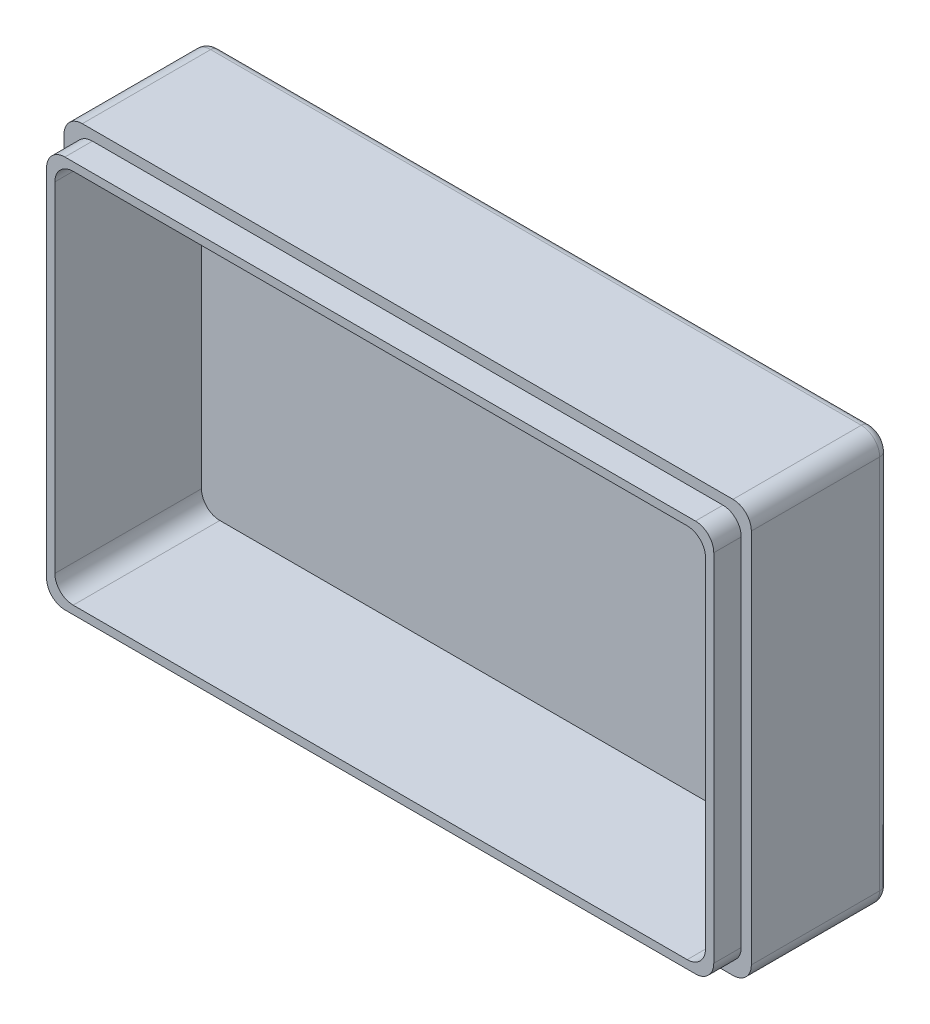
ISO-10303-21;
HEADER;
FILE_DESCRIPTION(('STEP AP214'),'2;1');
FILE_NAME('part.step','',(''),(''),'','','');
FILE_SCHEMA(('AUTOMOTIVE_DESIGN { 1 0 10303 214 1 1 1 1 }'));
ENDSEC;
DATA;
#1=APPLICATION_CONTEXT('core data for automotive mechanical design processes');
#2=APPLICATION_PROTOCOL_DEFINITION('international standard','automotive_design',2000,#1);
#3=PRODUCT_CONTEXT('',#1,'mechanical');
#4=PRODUCT('Part','Part','',(#3));
#5=PRODUCT_RELATED_PRODUCT_CATEGORY('part','',(#4));
#6=PRODUCT_DEFINITION_FORMATION('','',#4);
#7=PRODUCT_DEFINITION_CONTEXT('part definition',#1,'design');
#8=PRODUCT_DEFINITION('design','',#6,#7);
#9=PRODUCT_DEFINITION_SHAPE('','',#8);
#10=(LENGTH_UNIT() NAMED_UNIT(*) SI_UNIT(.MILLI.,.METRE.));
#11=(NAMED_UNIT(*) PLANE_ANGLE_UNIT() SI_UNIT($,.RADIAN.));
#12=(NAMED_UNIT(*) SI_UNIT($,.STERADIAN.) SOLID_ANGLE_UNIT());
#13=UNCERTAINTY_MEASURE_WITH_UNIT(LENGTH_MEASURE(1.E-05),#10,'distance_accuracy_value','');
#14=(GEOMETRIC_REPRESENTATION_CONTEXT(3) GLOBAL_UNCERTAINTY_ASSIGNED_CONTEXT((#13)) GLOBAL_UNIT_ASSIGNED_CONTEXT((#10,
#11,#12)) REPRESENTATION_CONTEXT('',''));
#15=CARTESIAN_POINT('',(0.,0.,0.));
#16=DIRECTION('',(0.,0.,1.));
#17=DIRECTION('',(1.,0.,0.));
#18=AXIS2_PLACEMENT_3D('',#15,#16,#17);
#19=CARTESIAN_POINT('',(0.,0.,18.));
#20=DIRECTION('',(0.,0.,1.));
#21=DIRECTION('',(1.,0.,0.));
#22=AXIS2_PLACEMENT_3D('',#19,#20,#21);
#23=PLANE('',#22);
#24=DIRECTION('',(-1.,0.,0.));
#25=VECTOR('',#24,1.);
#26=CARTESIAN_POINT('',(35.5,20.5,18.));
#27=LINE('',#26,#25);
#28=CARTESIAN_POINT('',(33.5,20.5,18.));
#29=VERTEX_POINT('',#28);
#30=CARTESIAN_POINT('',(-33.5,20.5,18.));
#31=VERTEX_POINT('',#30);
#32=EDGE_CURVE('E243',#29,#31,#27,.T.);
#33=ORIENTED_EDGE('',*,*,#32,.F.);
#34=CARTESIAN_POINT('',(33.5,18.5,18.));
#35=DIRECTION('',(0.,0.,1.));
#36=DIRECTION('',(1.,0.,0.));
#37=AXIS2_PLACEMENT_3D('',#34,#35,#36);
#38=CIRCLE('',#37,2.);
#39=CARTESIAN_POINT('',(35.5,18.5,18.));
#40=VERTEX_POINT('',#39);
#41=EDGE_CURVE('E226',#29,#40,#38,.F.);
#42=ORIENTED_EDGE('',*,*,#41,.T.);
#43=DIRECTION('',(0.,1.,0.));
#44=VECTOR('',#43,1.);
#45=CARTESIAN_POINT('',(35.5,-20.5,18.));
#46=LINE('',#45,#44);
#47=CARTESIAN_POINT('',(35.5,-18.5,18.));
#48=VERTEX_POINT('',#47);
#49=EDGE_CURVE('E267',#48,#40,#46,.T.);
#50=ORIENTED_EDGE('',*,*,#49,.F.);
#51=CARTESIAN_POINT('',(33.5,-18.5,18.));
#52=DIRECTION('',(0.,0.,1.));
#53=DIRECTION('',(1.,0.,0.));
#54=AXIS2_PLACEMENT_3D('',#51,#52,#53);
#55=CIRCLE('',#54,2.);
#56=CARTESIAN_POINT('',(33.5,-20.5,18.));
#57=VERTEX_POINT('',#56);
#58=EDGE_CURVE('E347',#48,#57,#55,.F.);
#59=ORIENTED_EDGE('',*,*,#58,.T.);
#60=DIRECTION('',(1.,0.,0.));
#61=VECTOR('',#60,1.);
#62=CARTESIAN_POINT('',(-35.5,-20.5,18.));
#63=LINE('',#62,#61);
#64=CARTESIAN_POINT('',(-33.5,-20.5,18.));
#65=VERTEX_POINT('',#64);
#66=EDGE_CURVE('E256',#65,#57,#63,.T.);
#67=ORIENTED_EDGE('',*,*,#66,.F.);
#68=CARTESIAN_POINT('',(-33.5,-18.5,18.));
#69=DIRECTION('',(0.,0.,1.));
#70=DIRECTION('',(1.,0.,0.));
#71=AXIS2_PLACEMENT_3D('',#68,#69,#70);
#72=CIRCLE('',#71,2.);
#73=CARTESIAN_POINT('',(-35.5,-18.5,18.));
#74=VERTEX_POINT('',#73);
#75=EDGE_CURVE('E345',#65,#74,#72,.F.);
#76=ORIENTED_EDGE('',*,*,#75,.T.);
#77=DIRECTION('',(0.,-1.,0.));
#78=VECTOR('',#77,1.);
#79=CARTESIAN_POINT('',(-35.5,20.5,18.));
#80=LINE('',#79,#78);
#81=CARTESIAN_POINT('',(-35.5,18.5,18.));
#82=VERTEX_POINT('',#81);
#83=EDGE_CURVE('E252',#82,#74,#80,.T.);
#84=ORIENTED_EDGE('',*,*,#83,.F.);
#85=CARTESIAN_POINT('',(-33.5,18.5,18.));
#86=DIRECTION('',(0.,0.,1.));
#87=DIRECTION('',(1.,0.,0.));
#88=AXIS2_PLACEMENT_3D('',#85,#86,#87);
#89=CIRCLE('',#88,2.);
#90=EDGE_CURVE('E236',#82,#31,#89,.F.);
#91=ORIENTED_EDGE('',*,*,#90,.T.);
#92=EDGE_LOOP('',(#33,#42,#50,#59,#67,#76,#84,#91));
#93=FACE_BOUND('',#92,.T.);
#94=DIRECTION('',(0.,1.,0.));
#95=VECTOR('',#94,1.);
#96=CARTESIAN_POINT('',(36.4,-21.4,18.));
#97=LINE('',#96,#95);
#98=CARTESIAN_POINT('',(36.4,-19.4,18.));
#99=VERTEX_POINT('',#98);
#100=CARTESIAN_POINT('',(36.4,19.4,18.));
#101=VERTEX_POINT('',#100);
#102=EDGE_CURVE('E418',#99,#101,#97,.T.);
#103=ORIENTED_EDGE('',*,*,#102,.T.);
#104=CARTESIAN_POINT('',(34.4,19.4,18.));
#105=DIRECTION('',(0.,0.,1.));
#106=DIRECTION('',(1.,0.,0.));
#107=AXIS2_PLACEMENT_3D('',#104,#105,#106);
#108=CIRCLE('',#107,2.);
#109=CARTESIAN_POINT('',(34.4,21.4,18.));
#110=VERTEX_POINT('',#109);
#111=EDGE_CURVE('E302',#101,#110,#108,.T.);
#112=ORIENTED_EDGE('',*,*,#111,.T.);
#113=DIRECTION('',(-1.,0.,0.));
#114=VECTOR('',#113,1.);
#115=CARTESIAN_POINT('',(36.4,21.4,18.));
#116=LINE('',#115,#114);
#117=CARTESIAN_POINT('',(-34.4,21.4,18.));
#118=VERTEX_POINT('',#117);
#119=EDGE_CURVE('E426',#110,#118,#116,.T.);
#120=ORIENTED_EDGE('',*,*,#119,.T.);
#121=CARTESIAN_POINT('',(-34.4,19.4,18.));
#122=DIRECTION('',(0.,0.,1.));
#123=DIRECTION('',(1.,0.,0.));
#124=AXIS2_PLACEMENT_3D('',#121,#122,#123);
#125=CIRCLE('',#124,2.);
#126=CARTESIAN_POINT('',(-36.4,19.4,18.));
#127=VERTEX_POINT('',#126);
#128=EDGE_CURVE('E296',#118,#127,#125,.T.);
#129=ORIENTED_EDGE('',*,*,#128,.T.);
#130=DIRECTION('',(0.,-1.,0.));
#131=VECTOR('',#130,1.);
#132=CARTESIAN_POINT('',(-36.4,21.4,18.));
#133=LINE('',#132,#131);
#134=CARTESIAN_POINT('',(-36.4,-19.4,18.));
#135=VERTEX_POINT('',#134);
#136=EDGE_CURVE('E408',#127,#135,#133,.T.);
#137=ORIENTED_EDGE('',*,*,#136,.T.);
#138=CARTESIAN_POINT('',(-34.4,-19.4,18.));
#139=DIRECTION('',(0.,0.,1.));
#140=DIRECTION('',(1.,0.,0.));
#141=AXIS2_PLACEMENT_3D('',#138,#139,#140);
#142=CIRCLE('',#141,2.);
#143=CARTESIAN_POINT('',(-34.4,-21.4,18.));
#144=VERTEX_POINT('',#143);
#145=EDGE_CURVE('E298',#135,#144,#142,.T.);
#146=ORIENTED_EDGE('',*,*,#145,.T.);
#147=DIRECTION('',(1.,0.,0.));
#148=VECTOR('',#147,1.);
#149=CARTESIAN_POINT('',(-36.4,-21.4,18.));
#150=LINE('',#149,#148);
#151=CARTESIAN_POINT('',(34.4,-21.4,18.));
#152=VERTEX_POINT('',#151);
#153=EDGE_CURVE('E414',#144,#152,#150,.T.);
#154=ORIENTED_EDGE('',*,*,#153,.T.);
#155=CARTESIAN_POINT('',(34.4,-19.4,18.));
#156=DIRECTION('',(0.,0.,1.));
#157=DIRECTION('',(1.,0.,0.));
#158=AXIS2_PLACEMENT_3D('',#155,#156,#157);
#159=CIRCLE('',#158,2.);
#160=EDGE_CURVE('E300',#152,#99,#159,.T.);
#161=ORIENTED_EDGE('',*,*,#160,.T.);
#162=EDGE_LOOP('',(#103,#112,#120,#129,#137,#146,#154,#161));
#163=FACE_BOUND('',#162,.T.);
#164=ADVANCED_FACE('F39',(#93,#163),#23,.T.);
#165=CARTESIAN_POINT('',(35.5,20.5,2.));
#166=DIRECTION('',(0.,1.,0.));
#167=DIRECTION('',(0.,0.,1.));
#168=AXIS2_PLACEMENT_3D('',#165,#166,#167);
#169=PLANE('',#168);
#170=DIRECTION('',(-1.,0.,0.));
#171=VECTOR('',#170,1.);
#172=CARTESIAN_POINT('',(35.5,20.5,2.));
#173=LINE('',#172,#171);
#174=CARTESIAN_POINT('',(33.5,20.5,2.));
#175=VERTEX_POINT('',#174);
#176=CARTESIAN_POINT('',(-33.5,20.5,2.));
#177=VERTEX_POINT('',#176);
#178=EDGE_CURVE('E246',#175,#177,#173,.T.);
#179=ORIENTED_EDGE('',*,*,#178,.F.);
#180=DIRECTION('',(0.,0.,1.));
#181=VECTOR('',#180,1.);
#182=CARTESIAN_POINT('',(33.5,20.5,18.));
#183=LINE('',#182,#181);
#184=EDGE_CURVE('E230',#175,#29,#183,.T.);
#185=ORIENTED_EDGE('',*,*,#184,.T.);
#186=ORIENTED_EDGE('',*,*,#32,.T.);
#187=DIRECTION('',(0.,0.,1.));
#188=VECTOR('',#187,1.);
#189=CARTESIAN_POINT('',(-33.5,20.5,2.));
#190=LINE('',#189,#188);
#191=EDGE_CURVE('E248',#31,#177,#190,.F.);
#192=ORIENTED_EDGE('',*,*,#191,.T.);
#193=EDGE_LOOP('',(#179,#185,#186,#192));
#194=FACE_BOUND('',#193,.T.);
#195=ADVANCED_FACE('F242',(#194),#169,.F.);
#196=CARTESIAN_POINT('',(35.5,-20.5,2.));
#197=DIRECTION('',(1.,0.,0.));
#198=DIRECTION('',(0.,0.,-1.));
#199=AXIS2_PLACEMENT_3D('',#196,#197,#198);
#200=PLANE('',#199);
#201=ORIENTED_EDGE('',*,*,#49,.T.);
#202=DIRECTION('',(0.,0.,1.));
#203=VECTOR('',#202,1.);
#204=CARTESIAN_POINT('',(35.5,18.5,2.));
#205=LINE('',#204,#203);
#206=CARTESIAN_POINT('',(35.5,18.5,2.));
#207=VERTEX_POINT('',#206);
#208=EDGE_CURVE('E231',#40,#207,#205,.F.);
#209=ORIENTED_EDGE('',*,*,#208,.T.);
#210=DIRECTION('',(0.,1.,0.));
#211=VECTOR('',#210,1.);
#212=CARTESIAN_POINT('',(35.5,-20.5,2.));
#213=LINE('',#212,#211);
#214=CARTESIAN_POINT('',(35.5,-18.5,2.));
#215=VERTEX_POINT('',#214);
#216=EDGE_CURVE('E262',#215,#207,#213,.T.);
#217=ORIENTED_EDGE('',*,*,#216,.F.);
#218=DIRECTION('',(0.,0.,1.));
#219=VECTOR('',#218,1.);
#220=CARTESIAN_POINT('',(35.5,-18.5,18.));
#221=LINE('',#220,#219);
#222=EDGE_CURVE('E247',#215,#48,#221,.T.);
#223=ORIENTED_EDGE('',*,*,#222,.T.);
#224=EDGE_LOOP('',(#201,#209,#217,#223));
#225=FACE_BOUND('',#224,.T.);
#226=ADVANCED_FACE('F451',(#225),#200,.F.);
#227=CARTESIAN_POINT('',(-35.5,-20.5,2.));
#228=DIRECTION('',(0.,-1.,0.));
#229=DIRECTION('',(0.,0.,-1.));
#230=AXIS2_PLACEMENT_3D('',#227,#228,#229);
#231=PLANE('',#230);
#232=DIRECTION('',(1.,0.,0.));
#233=VECTOR('',#232,1.);
#234=CARTESIAN_POINT('',(-35.5,-20.5,2.));
#235=LINE('',#234,#233);
#236=CARTESIAN_POINT('',(-33.5,-20.5,2.));
#237=VERTEX_POINT('',#236);
#238=CARTESIAN_POINT('',(33.5,-20.5,2.));
#239=VERTEX_POINT('',#238);
#240=EDGE_CURVE('E441',#237,#239,#235,.T.);
#241=ORIENTED_EDGE('',*,*,#240,.F.);
#242=DIRECTION('',(0.,0.,1.));
#243=VECTOR('',#242,1.);
#244=CARTESIAN_POINT('',(-33.5,-20.5,18.));
#245=LINE('',#244,#243);
#246=EDGE_CURVE('E288',#237,#65,#245,.T.);
#247=ORIENTED_EDGE('',*,*,#246,.T.);
#248=ORIENTED_EDGE('',*,*,#66,.T.);
#249=DIRECTION('',(0.,0.,1.));
#250=VECTOR('',#249,1.);
#251=CARTESIAN_POINT('',(33.5,-20.5,2.));
#252=LINE('',#251,#250);
#253=EDGE_CURVE('E286',#57,#239,#252,.F.);
#254=ORIENTED_EDGE('',*,*,#253,.T.);
#255=EDGE_LOOP('',(#241,#247,#248,#254));
#256=FACE_BOUND('',#255,.T.);
#257=ADVANCED_FACE('F457',(#256),#231,.F.);
#258=CARTESIAN_POINT('',(-35.5,20.5,2.));
#259=DIRECTION('',(-1.,0.,0.));
#260=DIRECTION('',(0.,0.,1.));
#261=AXIS2_PLACEMENT_3D('',#258,#259,#260);
#262=PLANE('',#261);
#263=DIRECTION('',(0.,-1.,0.));
#264=VECTOR('',#263,1.);
#265=CARTESIAN_POINT('',(-35.5,20.5,2.));
#266=LINE('',#265,#264);
#267=CARTESIAN_POINT('',(-35.5,18.5,2.));
#268=VERTEX_POINT('',#267);
#269=CARTESIAN_POINT('',(-35.5,-18.5,2.));
#270=VERTEX_POINT('',#269);
#271=EDGE_CURVE('E439',#268,#270,#266,.T.);
#272=ORIENTED_EDGE('',*,*,#271,.F.);
#273=DIRECTION('',(0.,0.,1.));
#274=VECTOR('',#273,1.);
#275=CARTESIAN_POINT('',(-35.5,18.5,18.));
#276=LINE('',#275,#274);
#277=EDGE_CURVE('E283',#268,#82,#276,.T.);
#278=ORIENTED_EDGE('',*,*,#277,.T.);
#279=ORIENTED_EDGE('',*,*,#83,.T.);
#280=DIRECTION('',(0.,0.,1.));
#281=VECTOR('',#280,1.);
#282=CARTESIAN_POINT('',(-35.5,-18.5,2.));
#283=LINE('',#282,#281);
#284=EDGE_CURVE('E281',#74,#270,#283,.F.);
#285=ORIENTED_EDGE('',*,*,#284,.T.);
#286=EDGE_LOOP('',(#272,#278,#279,#285));
#287=FACE_BOUND('',#286,.T.);
#288=ADVANCED_FACE('F465',(#287),#262,.F.);
#289=CARTESIAN_POINT('',(0.,0.,2.));
#290=DIRECTION('',(0.,0.,1.));
#291=DIRECTION('',(1.,0.,0.));
#292=AXIS2_PLACEMENT_3D('',#289,#290,#291);
#293=PLANE('',#292);
#294=ORIENTED_EDGE('',*,*,#216,.T.);
#295=CARTESIAN_POINT('',(33.5,18.5,2.));
#296=DIRECTION('',(0.,0.,1.));
#297=DIRECTION('',(1.,0.,0.));
#298=AXIS2_PLACEMENT_3D('',#295,#296,#297);
#299=CIRCLE('',#298,2.);
#300=EDGE_CURVE('E279',#207,#175,#299,.T.);
#301=ORIENTED_EDGE('',*,*,#300,.T.);
#302=ORIENTED_EDGE('',*,*,#178,.T.);
#303=CARTESIAN_POINT('',(-33.5,18.5,2.));
#304=DIRECTION('',(0.,0.,1.));
#305=DIRECTION('',(1.,0.,0.));
#306=AXIS2_PLACEMENT_3D('',#303,#304,#305);
#307=CIRCLE('',#306,2.);
#308=EDGE_CURVE('E277',#177,#268,#307,.T.);
#309=ORIENTED_EDGE('',*,*,#308,.T.);
#310=ORIENTED_EDGE('',*,*,#271,.T.);
#311=CARTESIAN_POINT('',(-33.5,-18.5,2.));
#312=DIRECTION('',(0.,0.,1.));
#313=DIRECTION('',(1.,0.,0.));
#314=AXIS2_PLACEMENT_3D('',#311,#312,#313);
#315=CIRCLE('',#314,2.);
#316=EDGE_CURVE('E275',#270,#237,#315,.T.);
#317=ORIENTED_EDGE('',*,*,#316,.T.);
#318=ORIENTED_EDGE('',*,*,#240,.T.);
#319=CARTESIAN_POINT('',(33.5,-18.5,2.));
#320=DIRECTION('',(0.,0.,1.));
#321=DIRECTION('',(1.,0.,0.));
#322=AXIS2_PLACEMENT_3D('',#319,#320,#321);
#323=CIRCLE('',#322,2.);
#324=EDGE_CURVE('E273',#239,#215,#323,.T.);
#325=ORIENTED_EDGE('',*,*,#324,.T.);
#326=EDGE_LOOP('',(#294,#301,#302,#309,#310,#317,#318,#325));
#327=FACE_BOUND('',#326,.T.);
#328=ADVANCED_FACE('F448',(#327),#293,.T.);
#329=CARTESIAN_POINT('',(0.,0.,15.));
#330=DIRECTION('',(0.,0.,1.));
#331=DIRECTION('',(1.,0.,0.));
#332=AXIS2_PLACEMENT_3D('',#329,#330,#331);
#333=PLANE('',#332);
#334=DIRECTION('',(-1.,0.,0.));
#335=VECTOR('',#334,1.);
#336=CARTESIAN_POINT('',(36.4,21.4,15.));
#337=LINE('',#336,#335);
#338=CARTESIAN_POINT('',(34.4,21.4,15.));
#339=VERTEX_POINT('',#338);
#340=CARTESIAN_POINT('',(-34.4,21.4,15.));
#341=VERTEX_POINT('',#340);
#342=EDGE_CURVE('E421',#339,#341,#337,.T.);
#343=ORIENTED_EDGE('',*,*,#342,.F.);
#344=CARTESIAN_POINT('',(34.4,19.4,15.));
#345=DIRECTION('',(0.,0.,1.));
#346=DIRECTION('',(1.,0.,0.));
#347=AXIS2_PLACEMENT_3D('',#344,#345,#346);
#348=CIRCLE('',#347,2.);
#349=CARTESIAN_POINT('',(36.4,19.4,15.));
#350=VERTEX_POINT('',#349);
#351=EDGE_CURVE('E349',#339,#350,#348,.F.);
#352=ORIENTED_EDGE('',*,*,#351,.T.);
#353=DIRECTION('',(0.,1.,0.));
#354=VECTOR('',#353,1.);
#355=CARTESIAN_POINT('',(36.4,-21.4,15.));
#356=LINE('',#355,#354);
#357=CARTESIAN_POINT('',(36.4,-19.4,15.));
#358=VERTEX_POINT('',#357);
#359=EDGE_CURVE('E850',#358,#350,#356,.T.);
#360=ORIENTED_EDGE('',*,*,#359,.F.);
#361=CARTESIAN_POINT('',(34.4,-19.4,15.));
#362=DIRECTION('',(0.,0.,1.));
#363=DIRECTION('',(1.,0.,0.));
#364=AXIS2_PLACEMENT_3D('',#361,#362,#363);
#365=CIRCLE('',#364,2.);
#366=CARTESIAN_POINT('',(34.4,-21.4,15.));
#367=VERTEX_POINT('',#366);
#368=EDGE_CURVE('E351',#358,#367,#365,.F.);
#369=ORIENTED_EDGE('',*,*,#368,.T.);
#370=DIRECTION('',(1.,0.,0.));
#371=VECTOR('',#370,1.);
#372=CARTESIAN_POINT('',(-36.4,-21.4,15.));
#373=LINE('',#372,#371);
#374=CARTESIAN_POINT('',(-34.4,-21.4,15.));
#375=VERTEX_POINT('',#374);
#376=EDGE_CURVE('E862',#375,#367,#373,.T.);
#377=ORIENTED_EDGE('',*,*,#376,.F.);
#378=CARTESIAN_POINT('',(-34.4,-19.4,15.));
#379=DIRECTION('',(0.,0.,1.));
#380=DIRECTION('',(1.,0.,0.));
#381=AXIS2_PLACEMENT_3D('',#378,#379,#380);
#382=CIRCLE('',#381,2.);
#383=CARTESIAN_POINT('',(-36.4,-19.4,15.));
#384=VERTEX_POINT('',#383);
#385=EDGE_CURVE('E353',#375,#384,#382,.F.);
#386=ORIENTED_EDGE('',*,*,#385,.T.);
#387=DIRECTION('',(0.,-1.,0.));
#388=VECTOR('',#387,1.);
#389=CARTESIAN_POINT('',(-36.4,21.4,15.));
#390=LINE('',#389,#388);
#391=CARTESIAN_POINT('',(-36.4,19.4,15.));
#392=VERTEX_POINT('',#391);
#393=EDGE_CURVE('E429',#392,#384,#390,.T.);
#394=ORIENTED_EDGE('',*,*,#393,.F.);
#395=CARTESIAN_POINT('',(-34.4,19.4,15.));
#396=DIRECTION('',(0.,0.,1.));
#397=DIRECTION('',(1.,0.,0.));
#398=AXIS2_PLACEMENT_3D('',#395,#396,#397);
#399=CIRCLE('',#398,2.);
#400=EDGE_CURVE('E355',#392,#341,#399,.F.);
#401=ORIENTED_EDGE('',*,*,#400,.T.);
#402=EDGE_LOOP('',(#343,#352,#360,#369,#377,#386,#394,#401));
#403=FACE_BOUND('',#402,.T.);
#404=DIRECTION('',(0.,1.,0.));
#405=VECTOR('',#404,1.);
#406=CARTESIAN_POINT('',(37.5,-22.5,15.));
#407=LINE('',#406,#405);
#408=CARTESIAN_POINT('',(37.5,-20.5,15.));
#409=VERTEX_POINT('',#408);
#410=CARTESIAN_POINT('',(37.5,20.5,15.));
#411=VERTEX_POINT('',#410);
#412=EDGE_CURVE('E259',#409,#411,#407,.T.);
#413=ORIENTED_EDGE('',*,*,#412,.T.);
#414=CARTESIAN_POINT('',(35.5,20.5,15.));
#415=DIRECTION('',(0.,0.,1.));
#416=DIRECTION('',(1.,0.,0.));
#417=AXIS2_PLACEMENT_3D('',#414,#415,#416);
#418=CIRCLE('',#417,2.);
#419=CARTESIAN_POINT('',(35.5,22.5,15.));
#420=VERTEX_POINT('',#419);
#421=EDGE_CURVE('E323',#411,#420,#418,.T.);
#422=ORIENTED_EDGE('',*,*,#421,.T.);
#423=DIRECTION('',(-1.,0.,0.));
#424=VECTOR('',#423,1.);
#425=CARTESIAN_POINT('',(37.5,22.5,15.));
#426=LINE('',#425,#424);
#427=CARTESIAN_POINT('',(-35.5,22.5,15.));
#428=VERTEX_POINT('',#427);
#429=EDGE_CURVE('E253',#420,#428,#426,.T.);
#430=ORIENTED_EDGE('',*,*,#429,.T.);
#431=CARTESIAN_POINT('',(-35.5,20.5,15.));
#432=DIRECTION('',(0.,0.,1.));
#433=DIRECTION('',(1.,0.,0.));
#434=AXIS2_PLACEMENT_3D('',#431,#432,#433);
#435=CIRCLE('',#434,2.);
#436=CARTESIAN_POINT('',(-37.5,20.5,15.));
#437=VERTEX_POINT('',#436);
#438=EDGE_CURVE('E317',#428,#437,#435,.T.);
#439=ORIENTED_EDGE('',*,*,#438,.T.);
#440=DIRECTION('',(0.,-1.,0.));
#441=VECTOR('',#440,1.);
#442=CARTESIAN_POINT('',(-37.5,22.5,15.));
#443=LINE('',#442,#441);
#444=CARTESIAN_POINT('',(-37.5,-20.5,15.));
#445=VERTEX_POINT('',#444);
#446=EDGE_CURVE('E430',#437,#445,#443,.T.);
#447=ORIENTED_EDGE('',*,*,#446,.T.);
#448=CARTESIAN_POINT('',(-35.5,-20.5,15.));
#449=DIRECTION('',(0.,0.,1.));
#450=DIRECTION('',(1.,0.,0.));
#451=AXIS2_PLACEMENT_3D('',#448,#449,#450);
#452=CIRCLE('',#451,2.);
#453=CARTESIAN_POINT('',(-35.5,-22.5,15.));
#454=VERTEX_POINT('',#453);
#455=EDGE_CURVE('E319',#445,#454,#452,.T.);
#456=ORIENTED_EDGE('',*,*,#455,.T.);
#457=DIRECTION('',(1.,0.,0.));
#458=VECTOR('',#457,1.);
#459=CARTESIAN_POINT('',(-37.5,-22.5,15.));
#460=LINE('',#459,#458);
#461=CARTESIAN_POINT('',(35.5,-22.5,15.));
#462=VERTEX_POINT('',#461);
#463=EDGE_CURVE('E433',#454,#462,#460,.T.);
#464=ORIENTED_EDGE('',*,*,#463,.T.);
#465=CARTESIAN_POINT('',(35.5,-20.5,15.));
#466=DIRECTION('',(0.,0.,1.));
#467=DIRECTION('',(1.,0.,0.));
#468=AXIS2_PLACEMENT_3D('',#465,#466,#467);
#469=CIRCLE('',#468,2.);
#470=EDGE_CURVE('E321',#462,#409,#469,.T.);
#471=ORIENTED_EDGE('',*,*,#470,.T.);
#472=EDGE_LOOP('',(#413,#422,#430,#439,#447,#456,#464,#471));
#473=FACE_BOUND('',#472,.T.);
#474=ADVANCED_FACE('F553',(#403,#473),#333,.T.);
#475=CARTESIAN_POINT('',(-36.4,21.4,15.));
#476=DIRECTION('',(-1.,0.,0.));
#477=DIRECTION('',(0.,-1.,0.));
#478=AXIS2_PLACEMENT_3D('',#475,#476,#477);
#479=PLANE('',#478);
#480=ORIENTED_EDGE('',*,*,#393,.T.);
#481=DIRECTION('',(0.,0.,1.));
#482=VECTOR('',#481,1.);
#483=CARTESIAN_POINT('',(-36.4,-19.4,15.));
#484=LINE('',#483,#482);
#485=EDGE_CURVE('E337',#384,#135,#484,.T.);
#486=ORIENTED_EDGE('',*,*,#485,.T.);
#487=ORIENTED_EDGE('',*,*,#136,.F.);
#488=DIRECTION('',(0.,0.,1.));
#489=VECTOR('',#488,1.);
#490=CARTESIAN_POINT('',(-36.4,19.4,15.));
#491=LINE('',#490,#489);
#492=EDGE_CURVE('E335',#127,#392,#491,.F.);
#493=ORIENTED_EDGE('',*,*,#492,.T.);
#494=EDGE_LOOP('',(#480,#486,#487,#493));
#495=FACE_BOUND('',#494,.T.);
#496=ADVANCED_FACE('F750',(#495),#479,.T.);
#497=CARTESIAN_POINT('',(36.4,21.4,15.));
#498=DIRECTION('',(0.,1.,0.));
#499=DIRECTION('',(-1.,0.,0.));
#500=AXIS2_PLACEMENT_3D('',#497,#498,#499);
#501=PLANE('',#500);
#502=ORIENTED_EDGE('',*,*,#119,.F.);
#503=DIRECTION('',(0.,0.,1.));
#504=VECTOR('',#503,1.);
#505=CARTESIAN_POINT('',(34.4,21.4,15.));
#506=LINE('',#505,#504);
#507=EDGE_CURVE('E307',#110,#339,#506,.F.);
#508=ORIENTED_EDGE('',*,*,#507,.T.);
#509=ORIENTED_EDGE('',*,*,#342,.T.);
#510=DIRECTION('',(0.,0.,1.));
#511=VECTOR('',#510,1.);
#512=CARTESIAN_POINT('',(-34.4,21.4,15.));
#513=LINE('',#512,#511);
#514=EDGE_CURVE('E304',#341,#118,#513,.T.);
#515=ORIENTED_EDGE('',*,*,#514,.T.);
#516=EDGE_LOOP('',(#502,#508,#509,#515));
#517=FACE_BOUND('',#516,.T.);
#518=ADVANCED_FACE('F741',(#517),#501,.T.);
#519=CARTESIAN_POINT('',(36.4,-21.4,15.));
#520=DIRECTION('',(1.,0.,0.));
#521=DIRECTION('',(0.,0.,-1.));
#522=AXIS2_PLACEMENT_3D('',#519,#520,#521);
#523=PLANE('',#522);
#524=ORIENTED_EDGE('',*,*,#359,.T.);
#525=DIRECTION('',(0.,0.,1.));
#526=VECTOR('',#525,1.);
#527=CARTESIAN_POINT('',(36.4,19.4,15.));
#528=LINE('',#527,#526);
#529=EDGE_CURVE('E293',#350,#101,#528,.T.);
#530=ORIENTED_EDGE('',*,*,#529,.T.);
#531=ORIENTED_EDGE('',*,*,#102,.F.);
#532=DIRECTION('',(0.,0.,1.));
#533=VECTOR('',#532,1.);
#534=CARTESIAN_POINT('',(36.4,-19.4,15.));
#535=LINE('',#534,#533);
#536=EDGE_CURVE('E291',#99,#358,#535,.F.);
#537=ORIENTED_EDGE('',*,*,#536,.T.);
#538=EDGE_LOOP('',(#524,#530,#531,#537));
#539=FACE_BOUND('',#538,.T.);
#540=ADVANCED_FACE('F732',(#539),#523,.T.);
#541=CARTESIAN_POINT('',(-36.4,-21.4,15.));
#542=DIRECTION('',(0.,-1.,0.));
#543=DIRECTION('',(1.,0.,0.));
#544=AXIS2_PLACEMENT_3D('',#541,#542,#543);
#545=PLANE('',#544);
#546=ORIENTED_EDGE('',*,*,#376,.T.);
#547=DIRECTION('',(0.,0.,1.));
#548=VECTOR('',#547,1.);
#549=CARTESIAN_POINT('',(34.4,-21.4,15.));
#550=LINE('',#549,#548);
#551=EDGE_CURVE('E327',#367,#152,#550,.T.);
#552=ORIENTED_EDGE('',*,*,#551,.T.);
#553=ORIENTED_EDGE('',*,*,#153,.F.);
#554=DIRECTION('',(0.,0.,1.));
#555=VECTOR('',#554,1.);
#556=CARTESIAN_POINT('',(-34.4,-21.4,15.));
#557=LINE('',#556,#555);
#558=EDGE_CURVE('E325',#144,#375,#557,.F.);
#559=ORIENTED_EDGE('',*,*,#558,.T.);
#560=EDGE_LOOP('',(#546,#552,#553,#559));
#561=FACE_BOUND('',#560,.T.);
#562=ADVANCED_FACE('F491',(#561),#545,.T.);
#563=CARTESIAN_POINT('',(0.,0.,0.));
#564=DIRECTION('',(0.,0.,1.));
#565=DIRECTION('',(1.,0.,0.));
#566=AXIS2_PLACEMENT_3D('',#563,#564,#565);
#567=PLANE('',#566);
#568=DIRECTION('',(0.,-1.,0.));
#569=VECTOR('',#568,1.);
#570=CARTESIAN_POINT('',(-36.5,0.,0.));
#571=LINE('',#570,#569);
#572=CARTESIAN_POINT('',(-36.5,-20.5,0.));
#573=VERTEX_POINT('',#572);
#574=CARTESIAN_POINT('',(-36.5,20.5,0.));
#575=VERTEX_POINT('',#574);
#576=EDGE_CURVE('E369',#573,#575,#571,.F.);
#577=ORIENTED_EDGE('',*,*,#576,.T.);
#578=CARTESIAN_POINT('',(-35.5,20.5,0.));
#579=DIRECTION('',(0.,0.,1.));
#580=DIRECTION('',(1.,0.,0.));
#581=AXIS2_PLACEMENT_3D('',#578,#579,#580);
#582=CIRCLE('',#581,1.);
#583=CARTESIAN_POINT('',(-35.5,21.5,0.));
#584=VERTEX_POINT('',#583);
#585=EDGE_CURVE('E371',#575,#584,#582,.F.);
#586=ORIENTED_EDGE('',*,*,#585,.T.);
#587=DIRECTION('',(-1.,0.,0.));
#588=VECTOR('',#587,1.);
#589=CARTESIAN_POINT('',(0.,21.5,0.));
#590=LINE('',#589,#588);
#591=CARTESIAN_POINT('',(35.5,21.5,0.));
#592=VERTEX_POINT('',#591);
#593=EDGE_CURVE('E357',#584,#592,#590,.F.);
#594=ORIENTED_EDGE('',*,*,#593,.T.);
#595=CARTESIAN_POINT('',(35.5,20.5,0.));
#596=DIRECTION('',(0.,0.,1.));
#597=DIRECTION('',(1.,0.,0.));
#598=AXIS2_PLACEMENT_3D('',#595,#596,#597);
#599=CIRCLE('',#598,1.);
#600=CARTESIAN_POINT('',(36.5,20.5,0.));
#601=VERTEX_POINT('',#600);
#602=EDGE_CURVE('E359',#592,#601,#599,.F.);
#603=ORIENTED_EDGE('',*,*,#602,.T.);
#604=DIRECTION('',(0.,1.,0.));
#605=VECTOR('',#604,1.);
#606=CARTESIAN_POINT('',(36.5,0.,0.));
#607=LINE('',#606,#605);
#608=CARTESIAN_POINT('',(36.5,-20.5,0.));
#609=VERTEX_POINT('',#608);
#610=EDGE_CURVE('E361',#601,#609,#607,.F.);
#611=ORIENTED_EDGE('',*,*,#610,.T.);
#612=CARTESIAN_POINT('',(35.5,-20.5,0.));
#613=DIRECTION('',(0.,0.,1.));
#614=DIRECTION('',(1.,0.,0.));
#615=AXIS2_PLACEMENT_3D('',#612,#613,#614);
#616=CIRCLE('',#615,1.);
#617=CARTESIAN_POINT('',(35.5,-21.5,0.));
#618=VERTEX_POINT('',#617);
#619=EDGE_CURVE('E363',#609,#618,#616,.F.);
#620=ORIENTED_EDGE('',*,*,#619,.T.);
#621=DIRECTION('',(1.,0.,0.));
#622=VECTOR('',#621,1.);
#623=CARTESIAN_POINT('',(0.,-21.5,0.));
#624=LINE('',#623,#622);
#625=CARTESIAN_POINT('',(-35.5,-21.5,0.));
#626=VERTEX_POINT('',#625);
#627=EDGE_CURVE('E365',#618,#626,#624,.F.);
#628=ORIENTED_EDGE('',*,*,#627,.T.);
#629=CARTESIAN_POINT('',(-35.5,-20.5,0.));
#630=DIRECTION('',(0.,0.,1.));
#631=DIRECTION('',(1.,0.,0.));
#632=AXIS2_PLACEMENT_3D('',#629,#630,#631);
#633=CIRCLE('',#632,1.);
#634=EDGE_CURVE('E367',#626,#573,#633,.F.);
#635=ORIENTED_EDGE('',*,*,#634,.T.);
#636=EDGE_LOOP('',(#577,#586,#594,#603,#611,#620,#628,#635));
#637=FACE_BOUND('',#636,.T.);
#638=ADVANCED_FACE('F487',(#637),#567,.F.);
#639=CARTESIAN_POINT('',(-37.5,22.5,18.));
#640=DIRECTION('',(0.,-1.,0.));
#641=DIRECTION('',(0.,0.,-1.));
#642=AXIS2_PLACEMENT_3D('',#639,#640,#641);
#643=PLANE('',#642);
#644=DIRECTION('',(0.,0.,-1.));
#645=VECTOR('',#644,1.);
#646=CARTESIAN_POINT('',(35.5,22.5,18.));
#647=LINE('',#646,#645);
#648=CARTESIAN_POINT('',(35.5,22.5,1.));
#649=VERTEX_POINT('',#648);
#650=EDGE_CURVE('E311',#420,#649,#647,.T.);
#651=ORIENTED_EDGE('',*,*,#650,.T.);
#652=DIRECTION('',(-1.,0.,0.));
#653=VECTOR('',#652,1.);
#654=CARTESIAN_POINT('',(-37.5,22.5,1.));
#655=LINE('',#654,#653);
#656=CARTESIAN_POINT('',(-35.5,22.5,1.));
#657=VERTEX_POINT('',#656);
#658=EDGE_CURVE('E11',#649,#657,#655,.T.);
#659=ORIENTED_EDGE('',*,*,#658,.T.);
#660=DIRECTION('',(0.,0.,-1.));
#661=VECTOR('',#660,1.);
#662=CARTESIAN_POINT('',(-35.5,22.5,18.));
#663=LINE('',#662,#661);
#664=EDGE_CURVE('E309',#657,#428,#663,.F.);
#665=ORIENTED_EDGE('',*,*,#664,.T.);
#666=ORIENTED_EDGE('',*,*,#429,.F.);
#667=EDGE_LOOP('',(#651,#659,#665,#666));
#668=FACE_BOUND('',#667,.T.);
#669=ADVANCED_FACE('F490',(#668),#643,.F.);
#670=CARTESIAN_POINT('',(37.5,22.5,18.));
#671=DIRECTION('',(-1.,0.,0.));
#672=DIRECTION('',(0.,-1.,0.));
#673=AXIS2_PLACEMENT_3D('',#670,#671,#672);
#674=PLANE('',#673);
#675=DIRECTION('',(0.,0.,-1.));
#676=VECTOR('',#675,1.);
#677=CARTESIAN_POINT('',(37.5,-20.5,18.));
#678=LINE('',#677,#676);
#679=CARTESIAN_POINT('',(37.5,-20.5,1.));
#680=VERTEX_POINT('',#679);
#681=EDGE_CURVE('E313',#409,#680,#678,.T.);
#682=ORIENTED_EDGE('',*,*,#681,.T.);
#683=DIRECTION('',(0.,1.,0.));
#684=VECTOR('',#683,1.);
#685=CARTESIAN_POINT('',(37.5,22.5,1.));
#686=LINE('',#685,#684);
#687=CARTESIAN_POINT('',(37.5,20.5,1.));
#688=VERTEX_POINT('',#687);
#689=EDGE_CURVE('E63',#680,#688,#686,.T.);
#690=ORIENTED_EDGE('',*,*,#689,.T.);
#691=DIRECTION('',(0.,0.,-1.));
#692=VECTOR('',#691,1.);
#693=CARTESIAN_POINT('',(37.5,20.5,18.));
#694=LINE('',#693,#692);
#695=EDGE_CURVE('E315',#688,#411,#694,.F.);
#696=ORIENTED_EDGE('',*,*,#695,.T.);
#697=ORIENTED_EDGE('',*,*,#412,.F.);
#698=EDGE_LOOP('',(#682,#690,#696,#697));
#699=FACE_BOUND('',#698,.T.);
#700=ADVANCED_FACE('F495',(#699),#674,.F.);
#701=CARTESIAN_POINT('',(-37.5,-22.5,18.));
#702=DIRECTION('',(0.,1.,0.));
#703=DIRECTION('',(0.,0.,1.));
#704=AXIS2_PLACEMENT_3D('',#701,#702,#703);
#705=PLANE('',#704);
#706=DIRECTION('',(0.,0.,-1.));
#707=VECTOR('',#706,1.);
#708=CARTESIAN_POINT('',(-35.5,-22.5,18.));
#709=LINE('',#708,#707);
#710=CARTESIAN_POINT('',(-35.5,-22.5,1.));
#711=VERTEX_POINT('',#710);
#712=EDGE_CURVE('E330',#454,#711,#709,.T.);
#713=ORIENTED_EDGE('',*,*,#712,.T.);
#714=DIRECTION('',(1.,0.,0.));
#715=VECTOR('',#714,1.);
#716=CARTESIAN_POINT('',(-37.5,-22.5,1.));
#717=LINE('',#716,#715);
#718=CARTESIAN_POINT('',(35.5,-22.5,1.));
#719=VERTEX_POINT('',#718);
#720=EDGE_CURVE('E381',#711,#719,#717,.T.);
#721=ORIENTED_EDGE('',*,*,#720,.T.);
#722=DIRECTION('',(0.,0.,-1.));
#723=VECTOR('',#722,1.);
#724=CARTESIAN_POINT('',(35.5,-22.5,18.));
#725=LINE('',#724,#723);
#726=EDGE_CURVE('E333',#719,#462,#725,.F.);
#727=ORIENTED_EDGE('',*,*,#726,.T.);
#728=ORIENTED_EDGE('',*,*,#463,.F.);
#729=EDGE_LOOP('',(#713,#721,#727,#728));
#730=FACE_BOUND('',#729,.T.);
#731=ADVANCED_FACE('F499',(#730),#705,.F.);
#732=CARTESIAN_POINT('',(-37.5,22.5,18.));
#733=DIRECTION('',(1.,0.,0.));
#734=DIRECTION('',(0.,1.,0.));
#735=AXIS2_PLACEMENT_3D('',#732,#733,#734);
#736=PLANE('',#735);
#737=DIRECTION('',(0.,0.,-1.));
#738=VECTOR('',#737,1.);
#739=CARTESIAN_POINT('',(-37.5,20.5,18.));
#740=LINE('',#739,#738);
#741=CARTESIAN_POINT('',(-37.5,20.5,1.));
#742=VERTEX_POINT('',#741);
#743=EDGE_CURVE('E340',#437,#742,#740,.T.);
#744=ORIENTED_EDGE('',*,*,#743,.T.);
#745=DIRECTION('',(0.,-1.,0.));
#746=VECTOR('',#745,1.);
#747=CARTESIAN_POINT('',(-37.5,22.5,1.));
#748=LINE('',#747,#746);
#749=CARTESIAN_POINT('',(-37.5,-20.5,1.));
#750=VERTEX_POINT('',#749);
#751=EDGE_CURVE('E377',#742,#750,#748,.T.);
#752=ORIENTED_EDGE('',*,*,#751,.T.);
#753=DIRECTION('',(0.,0.,-1.));
#754=VECTOR('',#753,1.);
#755=CARTESIAN_POINT('',(-37.5,-20.5,18.));
#756=LINE('',#755,#754);
#757=EDGE_CURVE('E237',#750,#445,#756,.F.);
#758=ORIENTED_EDGE('',*,*,#757,.T.);
#759=ORIENTED_EDGE('',*,*,#446,.F.);
#760=EDGE_LOOP('',(#744,#752,#758,#759));
#761=FACE_BOUND('',#760,.T.);
#762=ADVANCED_FACE('F477',(#761),#736,.F.);
#763=CARTESIAN_POINT('',(33.5,18.5,2.));
#764=DIRECTION('',(0.,0.,-1.));
#765=DIRECTION('',(-1.,0.,0.));
#766=AXIS2_PLACEMENT_3D('',#763,#764,#765);
#767=CYLINDRICAL_SURFACE('',#766,2.);
#768=ORIENTED_EDGE('',*,*,#300,.F.);
#769=ORIENTED_EDGE('',*,*,#208,.F.);
#770=ORIENTED_EDGE('',*,*,#41,.F.);
#771=ORIENTED_EDGE('',*,*,#184,.F.);
#772=EDGE_LOOP('',(#768,#769,#770,#771));
#773=FACE_BOUND('',#772,.T.);
#774=ADVANCED_FACE('F229',(#773),#767,.F.);
#775=CARTESIAN_POINT('',(-33.5,18.5,2.));
#776=DIRECTION('',(0.,0.,-1.));
#777=DIRECTION('',(-1.,0.,0.));
#778=AXIS2_PLACEMENT_3D('',#775,#776,#777);
#779=CYLINDRICAL_SURFACE('',#778,2.);
#780=ORIENTED_EDGE('',*,*,#308,.F.);
#781=ORIENTED_EDGE('',*,*,#191,.F.);
#782=ORIENTED_EDGE('',*,*,#90,.F.);
#783=ORIENTED_EDGE('',*,*,#277,.F.);
#784=EDGE_LOOP('',(#780,#781,#782,#783));
#785=FACE_BOUND('',#784,.T.);
#786=ADVANCED_FACE('F469',(#785),#779,.F.);
#787=CARTESIAN_POINT('',(-33.5,-18.5,2.));
#788=DIRECTION('',(0.,0.,-1.));
#789=DIRECTION('',(-1.,0.,0.));
#790=AXIS2_PLACEMENT_3D('',#787,#788,#789);
#791=CYLINDRICAL_SURFACE('',#790,2.);
#792=ORIENTED_EDGE('',*,*,#316,.F.);
#793=ORIENTED_EDGE('',*,*,#284,.F.);
#794=ORIENTED_EDGE('',*,*,#75,.F.);
#795=ORIENTED_EDGE('',*,*,#246,.F.);
#796=EDGE_LOOP('',(#792,#793,#794,#795));
#797=FACE_BOUND('',#796,.T.);
#798=ADVANCED_FACE('F461',(#797),#791,.F.);
#799=CARTESIAN_POINT('',(33.5,-18.5,2.));
#800=DIRECTION('',(0.,0.,-1.));
#801=DIRECTION('',(-1.,0.,0.));
#802=AXIS2_PLACEMENT_3D('',#799,#800,#801);
#803=CYLINDRICAL_SURFACE('',#802,2.);
#804=ORIENTED_EDGE('',*,*,#324,.F.);
#805=ORIENTED_EDGE('',*,*,#253,.F.);
#806=ORIENTED_EDGE('',*,*,#58,.F.);
#807=ORIENTED_EDGE('',*,*,#222,.F.);
#808=EDGE_LOOP('',(#804,#805,#806,#807));
#809=FACE_BOUND('',#808,.T.);
#810=ADVANCED_FACE('F453',(#809),#803,.F.);
#811=CARTESIAN_POINT('',(34.4,19.4,15.));
#812=DIRECTION('',(0.,0.,1.));
#813=DIRECTION('',(1.,0.,0.));
#814=AXIS2_PLACEMENT_3D('',#811,#812,#813);
#815=CYLINDRICAL_SURFACE('',#814,2.);
#816=ORIENTED_EDGE('',*,*,#351,.F.);
#817=ORIENTED_EDGE('',*,*,#507,.F.);
#818=ORIENTED_EDGE('',*,*,#111,.F.);
#819=ORIENTED_EDGE('',*,*,#529,.F.);
#820=EDGE_LOOP('',(#816,#817,#818,#819));
#821=FACE_BOUND('',#820,.T.);
#822=ADVANCED_FACE('F596',(#821),#815,.T.);
#823=CARTESIAN_POINT('',(35.5,20.5,18.));
#824=DIRECTION('',(0.,0.,-1.));
#825=DIRECTION('',(-1.,0.,0.));
#826=AXIS2_PLACEMENT_3D('',#823,#824,#825);
#827=CYLINDRICAL_SURFACE('',#826,2.);
#828=ORIENTED_EDGE('',*,*,#695,.F.);
#829=CARTESIAN_POINT('',(35.5,20.5,1.));
#830=DIRECTION('',(0.,0.,1.));
#831=DIRECTION('',(1.,0.,0.));
#832=AXIS2_PLACEMENT_3D('',#829,#830,#831);
#833=CIRCLE('',#832,2.);
#834=EDGE_CURVE('E48',#688,#649,#833,.T.);
#835=ORIENTED_EDGE('',*,*,#834,.T.);
#836=ORIENTED_EDGE('',*,*,#650,.F.);
#837=ORIENTED_EDGE('',*,*,#421,.F.);
#838=EDGE_LOOP('',(#828,#835,#836,#837));
#839=FACE_BOUND('',#838,.T.);
#840=ADVANCED_FACE('F555',(#839),#827,.T.);
#841=CARTESIAN_POINT('',(34.4,-19.4,15.));
#842=DIRECTION('',(0.,0.,1.));
#843=DIRECTION('',(1.,0.,0.));
#844=AXIS2_PLACEMENT_3D('',#841,#842,#843);
#845=CYLINDRICAL_SURFACE('',#844,2.);
#846=ORIENTED_EDGE('',*,*,#368,.F.);
#847=ORIENTED_EDGE('',*,*,#536,.F.);
#848=ORIENTED_EDGE('',*,*,#160,.F.);
#849=ORIENTED_EDGE('',*,*,#551,.F.);
#850=EDGE_LOOP('',(#846,#847,#848,#849));
#851=FACE_BOUND('',#850,.T.);
#852=ADVANCED_FACE('F590',(#851),#845,.T.);
#853=CARTESIAN_POINT('',(35.5,-20.5,18.));
#854=DIRECTION('',(0.,0.,-1.));
#855=DIRECTION('',(-1.,0.,0.));
#856=AXIS2_PLACEMENT_3D('',#853,#854,#855);
#857=CYLINDRICAL_SURFACE('',#856,2.);
#858=ORIENTED_EDGE('',*,*,#726,.F.);
#859=CARTESIAN_POINT('',(35.5,-20.5,1.));
#860=DIRECTION('',(0.,0.,1.));
#861=DIRECTION('',(1.,0.,0.));
#862=AXIS2_PLACEMENT_3D('',#859,#860,#861);
#863=CIRCLE('',#862,2.);
#864=EDGE_CURVE('E383',#719,#680,#863,.T.);
#865=ORIENTED_EDGE('',*,*,#864,.T.);
#866=ORIENTED_EDGE('',*,*,#681,.F.);
#867=ORIENTED_EDGE('',*,*,#470,.F.);
#868=EDGE_LOOP('',(#858,#865,#866,#867));
#869=FACE_BOUND('',#868,.T.);
#870=ADVANCED_FACE('F548',(#869),#857,.T.);
#871=CARTESIAN_POINT('',(-34.4,-19.4,15.));
#872=DIRECTION('',(0.,0.,1.));
#873=DIRECTION('',(1.,0.,0.));
#874=AXIS2_PLACEMENT_3D('',#871,#872,#873);
#875=CYLINDRICAL_SURFACE('',#874,2.);
#876=ORIENTED_EDGE('',*,*,#385,.F.);
#877=ORIENTED_EDGE('',*,*,#558,.F.);
#878=ORIENTED_EDGE('',*,*,#145,.F.);
#879=ORIENTED_EDGE('',*,*,#485,.F.);
#880=EDGE_LOOP('',(#876,#877,#878,#879));
#881=FACE_BOUND('',#880,.T.);
#882=ADVANCED_FACE('F584',(#881),#875,.T.);
#883=CARTESIAN_POINT('',(-35.5,-20.5,18.));
#884=DIRECTION('',(0.,0.,-1.));
#885=DIRECTION('',(-1.,0.,0.));
#886=AXIS2_PLACEMENT_3D('',#883,#884,#885);
#887=CYLINDRICAL_SURFACE('',#886,2.);
#888=ORIENTED_EDGE('',*,*,#757,.F.);
#889=CARTESIAN_POINT('',(-35.5,-20.5,1.));
#890=DIRECTION('',(0.,0.,1.));
#891=DIRECTION('',(1.,0.,0.));
#892=AXIS2_PLACEMENT_3D('',#889,#890,#891);
#893=CIRCLE('',#892,2.);
#894=EDGE_CURVE('E379',#750,#711,#893,.T.);
#895=ORIENTED_EDGE('',*,*,#894,.T.);
#896=ORIENTED_EDGE('',*,*,#712,.F.);
#897=ORIENTED_EDGE('',*,*,#455,.F.);
#898=EDGE_LOOP('',(#888,#895,#896,#897));
#899=FACE_BOUND('',#898,.T.);
#900=ADVANCED_FACE('F538',(#899),#887,.T.);
#901=CARTESIAN_POINT('',(-34.4,19.4,15.));
#902=DIRECTION('',(0.,0.,1.));
#903=DIRECTION('',(1.,0.,0.));
#904=AXIS2_PLACEMENT_3D('',#901,#902,#903);
#905=CYLINDRICAL_SURFACE('',#904,2.);
#906=ORIENTED_EDGE('',*,*,#400,.F.);
#907=ORIENTED_EDGE('',*,*,#492,.F.);
#908=ORIENTED_EDGE('',*,*,#128,.F.);
#909=ORIENTED_EDGE('',*,*,#514,.F.);
#910=EDGE_LOOP('',(#906,#907,#908,#909));
#911=FACE_BOUND('',#910,.T.);
#912=ADVANCED_FACE('F578',(#911),#905,.T.);
#913=CARTESIAN_POINT('',(-35.5,20.5,18.));
#914=DIRECTION('',(0.,0.,-1.));
#915=DIRECTION('',(-1.,0.,0.));
#916=AXIS2_PLACEMENT_3D('',#913,#914,#915);
#917=CYLINDRICAL_SURFACE('',#916,2.);
#918=ORIENTED_EDGE('',*,*,#664,.F.);
#919=CARTESIAN_POINT('',(-35.5,20.5,1.));
#920=DIRECTION('',(0.,0.,1.));
#921=DIRECTION('',(1.,0.,0.));
#922=AXIS2_PLACEMENT_3D('',#919,#920,#921);
#923=CIRCLE('',#922,2.);
#924=EDGE_CURVE('E374',#657,#742,#923,.T.);
#925=ORIENTED_EDGE('',*,*,#924,.T.);
#926=ORIENTED_EDGE('',*,*,#743,.F.);
#927=ORIENTED_EDGE('',*,*,#438,.F.);
#928=EDGE_LOOP('',(#918,#925,#926,#927));
#929=FACE_BOUND('',#928,.T.);
#930=ADVANCED_FACE('F514',(#929),#917,.T.);
#931=CARTESIAN_POINT('',(35.5,-20.5,1.));
#932=DIRECTION('',(0.,0.,1.));
#933=DIRECTION('',(1.,0.,0.));
#934=AXIS2_PLACEMENT_3D('',#931,#932,#933);
#935=DEGENERATE_TOROIDAL_SURFACE('',#934,1.,1.,.T.);
#936=CARTESIAN_POINT('',(36.5,-20.5,1.));
#937=DIRECTION('',(0.,1.,0.));
#938=DIRECTION('',(0.,0.,1.));
#939=AXIS2_PLACEMENT_3D('',#936,#937,#938);
#940=CIRCLE('',#939,1.);
#941=EDGE_CURVE('E402',#680,#609,#940,.T.);
#942=ORIENTED_EDGE('',*,*,#941,.F.);
#943=ORIENTED_EDGE('',*,*,#864,.F.);
#944=CARTESIAN_POINT('',(35.5,-21.5,1.));
#945=DIRECTION('',(-1.,0.,0.));
#946=DIRECTION('',(0.,0.,1.));
#947=AXIS2_PLACEMENT_3D('',#944,#945,#946);
#948=CIRCLE('',#947,1.);
#949=EDGE_CURVE('E43',#618,#719,#948,.T.);
#950=ORIENTED_EDGE('',*,*,#949,.F.);
#951=ORIENTED_EDGE('',*,*,#619,.F.);
#952=EDGE_LOOP('',(#942,#943,#950,#951));
#953=FACE_BOUND('',#952,.T.);
#954=ADVANCED_FACE('F41',(#953),#935,.T.);
#955=CARTESIAN_POINT('',(-37.5,-21.5,1.));
#956=DIRECTION('',(1.,0.,0.));
#957=DIRECTION('',(0.,0.,-1.));
#958=AXIS2_PLACEMENT_3D('',#955,#956,#957);
#959=CYLINDRICAL_SURFACE('',#958,1.);
#960=ORIENTED_EDGE('',*,*,#949,.T.);
#961=ORIENTED_EDGE('',*,*,#720,.F.);
#962=CARTESIAN_POINT('',(-35.5,-21.5,1.));
#963=DIRECTION('',(-1.,0.,0.));
#964=DIRECTION('',(0.,0.,1.));
#965=AXIS2_PLACEMENT_3D('',#962,#963,#964);
#966=CIRCLE('',#965,1.);
#967=EDGE_CURVE('E400',#626,#711,#966,.T.);
#968=ORIENTED_EDGE('',*,*,#967,.F.);
#969=ORIENTED_EDGE('',*,*,#627,.F.);
#970=EDGE_LOOP('',(#960,#961,#968,#969));
#971=FACE_BOUND('',#970,.T.);
#972=ADVANCED_FACE('F542',(#971),#959,.T.);
#973=CARTESIAN_POINT('',(36.5,22.5,1.));
#974=DIRECTION('',(0.,1.,0.));
#975=DIRECTION('',(-1.,0.,0.));
#976=AXIS2_PLACEMENT_3D('',#973,#974,#975);
#977=CYLINDRICAL_SURFACE('',#976,1.);
#978=ORIENTED_EDGE('',*,*,#941,.T.);
#979=ORIENTED_EDGE('',*,*,#610,.F.);
#980=CARTESIAN_POINT('',(36.5,20.5,1.));
#981=DIRECTION('',(0.,1.,0.));
#982=DIRECTION('',(0.,0.,1.));
#983=AXIS2_PLACEMENT_3D('',#980,#981,#982);
#984=CIRCLE('',#983,1.);
#985=EDGE_CURVE('E397',#688,#601,#984,.T.);
#986=ORIENTED_EDGE('',*,*,#985,.F.);
#987=ORIENTED_EDGE('',*,*,#689,.F.);
#988=EDGE_LOOP('',(#978,#979,#986,#987));
#989=FACE_BOUND('',#988,.T.);
#990=ADVANCED_FACE('F559',(#989),#977,.T.);
#991=CARTESIAN_POINT('',(-35.5,-20.5,1.));
#992=DIRECTION('',(0.,0.,1.));
#993=DIRECTION('',(1.,0.,0.));
#994=AXIS2_PLACEMENT_3D('',#991,#992,#993);
#995=DEGENERATE_TOROIDAL_SURFACE('',#994,1.,1.,.T.);
#996=ORIENTED_EDGE('',*,*,#967,.T.);
#997=ORIENTED_EDGE('',*,*,#894,.F.);
#998=CARTESIAN_POINT('',(-36.5,-20.5,1.));
#999=DIRECTION('',(0.,1.,0.));
#1000=DIRECTION('',(0.,0.,1.));
#1001=AXIS2_PLACEMENT_3D('',#998,#999,#1000);
#1002=CIRCLE('',#1001,1.);
#1003=EDGE_CURVE('E394',#573,#750,#1002,.T.);
#1004=ORIENTED_EDGE('',*,*,#1003,.F.);
#1005=ORIENTED_EDGE('',*,*,#634,.F.);
#1006=EDGE_LOOP('',(#996,#997,#1004,#1005));
#1007=FACE_BOUND('',#1006,.T.);
#1008=ADVANCED_FACE('F534',(#1007),#995,.T.);
#1009=CARTESIAN_POINT('',(35.5,20.5,1.));
#1010=DIRECTION('',(0.,0.,1.));
#1011=DIRECTION('',(1.,0.,0.));
#1012=AXIS2_PLACEMENT_3D('',#1009,#1010,#1011);
#1013=DEGENERATE_TOROIDAL_SURFACE('',#1012,1.,1.,.T.);
#1014=ORIENTED_EDGE('',*,*,#985,.T.);
#1015=ORIENTED_EDGE('',*,*,#602,.F.);
#1016=CARTESIAN_POINT('',(35.5,21.5,1.));
#1017=DIRECTION('',(-1.,0.,0.));
#1018=DIRECTION('',(0.,0.,1.));
#1019=AXIS2_PLACEMENT_3D('',#1016,#1017,#1018);
#1020=CIRCLE('',#1019,1.);
#1021=EDGE_CURVE('E391',#649,#592,#1020,.T.);
#1022=ORIENTED_EDGE('',*,*,#1021,.F.);
#1023=ORIENTED_EDGE('',*,*,#834,.F.);
#1024=EDGE_LOOP('',(#1014,#1015,#1022,#1023));
#1025=FACE_BOUND('',#1024,.T.);
#1026=ADVANCED_FACE('F558',(#1025),#1013,.T.);
#1027=CARTESIAN_POINT('',(-36.5,22.5,1.));
#1028=DIRECTION('',(0.,-1.,0.));
#1029=DIRECTION('',(1.,0.,0.));
#1030=AXIS2_PLACEMENT_3D('',#1027,#1028,#1029);
#1031=CYLINDRICAL_SURFACE('',#1030,1.);
#1032=ORIENTED_EDGE('',*,*,#1003,.T.);
#1033=ORIENTED_EDGE('',*,*,#751,.F.);
#1034=CARTESIAN_POINT('',(-36.5,20.5,1.));
#1035=DIRECTION('',(0.,1.,0.));
#1036=DIRECTION('',(0.,0.,1.));
#1037=AXIS2_PLACEMENT_3D('',#1034,#1035,#1036);
#1038=CIRCLE('',#1037,1.);
#1039=EDGE_CURVE('E389',#575,#742,#1038,.T.);
#1040=ORIENTED_EDGE('',*,*,#1039,.F.);
#1041=ORIENTED_EDGE('',*,*,#576,.F.);
#1042=EDGE_LOOP('',(#1032,#1033,#1040,#1041));
#1043=FACE_BOUND('',#1042,.T.);
#1044=ADVANCED_FACE('F531',(#1043),#1031,.T.);
#1045=CARTESIAN_POINT('',(-37.5,21.5,1.));
#1046=DIRECTION('',(-1.,0.,0.));
#1047=DIRECTION('',(0.,0.,1.));
#1048=AXIS2_PLACEMENT_3D('',#1045,#1046,#1047);
#1049=CYLINDRICAL_SURFACE('',#1048,1.);
#1050=ORIENTED_EDGE('',*,*,#1021,.T.);
#1051=ORIENTED_EDGE('',*,*,#593,.F.);
#1052=CARTESIAN_POINT('',(-35.5,21.5,1.));
#1053=DIRECTION('',(-1.,0.,0.));
#1054=DIRECTION('',(0.,0.,1.));
#1055=AXIS2_PLACEMENT_3D('',#1052,#1053,#1054);
#1056=CIRCLE('',#1055,1.);
#1057=EDGE_CURVE('E387',#657,#584,#1056,.T.);
#1058=ORIENTED_EDGE('',*,*,#1057,.F.);
#1059=ORIENTED_EDGE('',*,*,#658,.F.);
#1060=EDGE_LOOP('',(#1050,#1051,#1058,#1059));
#1061=FACE_BOUND('',#1060,.T.);
#1062=ADVANCED_FACE('F524',(#1061),#1049,.T.);
#1063=CARTESIAN_POINT('',(-35.5,20.5,1.));
#1064=DIRECTION('',(0.,0.,1.));
#1065=DIRECTION('',(1.,0.,0.));
#1066=AXIS2_PLACEMENT_3D('',#1063,#1064,#1065);
#1067=DEGENERATE_TOROIDAL_SURFACE('',#1066,1.,1.,.T.);
#1068=ORIENTED_EDGE('',*,*,#1039,.T.);
#1069=ORIENTED_EDGE('',*,*,#924,.F.);
#1070=ORIENTED_EDGE('',*,*,#1057,.T.);
#1071=ORIENTED_EDGE('',*,*,#585,.F.);
#1072=EDGE_LOOP('',(#1068,#1069,#1070,#1071));
#1073=FACE_BOUND('',#1072,.T.);
#1074=ADVANCED_FACE('F518',(#1073),#1067,.T.);
#1075=CLOSED_SHELL('',(#164,#195,#226,#257,#288,#328,#474,#496,#518,#540,#562,#638,#669,#700,
#731,#762,#774,#786,#798,#810,#822,#840,#852,#870,#882,#900,#912,#930,#954,#972,#990,#1008,
#1026,#1044,#1062,#1074));
#1076=MANIFOLD_SOLID_BREP('B2',#1075);
#1077=ADVANCED_BREP_SHAPE_REPRESENTATION('',(#18,#1076),#14);
#1078=SHAPE_DEFINITION_REPRESENTATION(#9,#1077);
ENDSEC;
END-ISO-10303-21;
